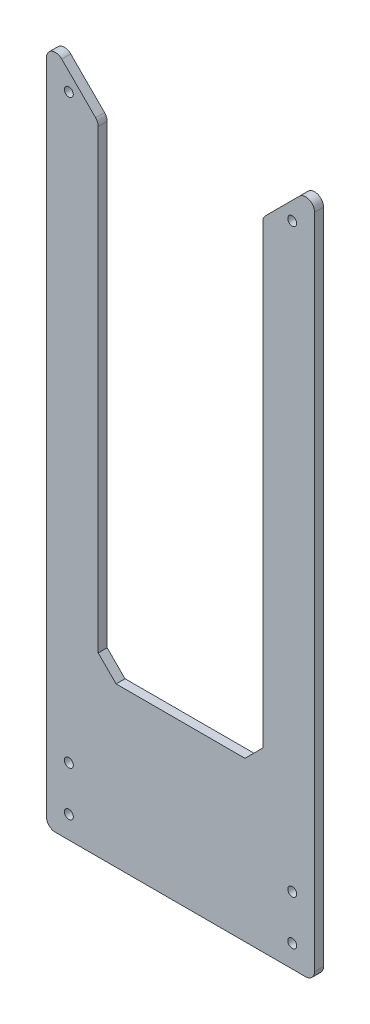
ISO-10303-21;
HEADER;
FILE_DESCRIPTION(('STEP AP214'),'2;1');
FILE_NAME('part.step','',(''),(''),'','','');
FILE_SCHEMA(('AUTOMOTIVE_DESIGN { 1 0 10303 214 1 1 1 1 }'));
ENDSEC;
DATA;
#1=APPLICATION_CONTEXT('core data for automotive mechanical design processes');
#2=APPLICATION_PROTOCOL_DEFINITION('international standard','automotive_design',2000,#1);
#3=PRODUCT_CONTEXT('',#1,'mechanical');
#4=PRODUCT('Part','Part','',(#3));
#5=PRODUCT_RELATED_PRODUCT_CATEGORY('part','',(#4));
#6=PRODUCT_DEFINITION_FORMATION('','',#4);
#7=PRODUCT_DEFINITION_CONTEXT('part definition',#1,'design');
#8=PRODUCT_DEFINITION('design','',#6,#7);
#9=PRODUCT_DEFINITION_SHAPE('','',#8);
#10=(LENGTH_UNIT() NAMED_UNIT(*) SI_UNIT(.MILLI.,.METRE.));
#11=(NAMED_UNIT(*) PLANE_ANGLE_UNIT() SI_UNIT($,.RADIAN.));
#12=(NAMED_UNIT(*) SI_UNIT($,.STERADIAN.) SOLID_ANGLE_UNIT());
#13=UNCERTAINTY_MEASURE_WITH_UNIT(LENGTH_MEASURE(1.E-05),#10,'distance_accuracy_value','');
#14=(GEOMETRIC_REPRESENTATION_CONTEXT(3) GLOBAL_UNCERTAINTY_ASSIGNED_CONTEXT((#13)) GLOBAL_UNIT_ASSIGNED_CONTEXT((#10,
#11,#12)) REPRESENTATION_CONTEXT('',''));
#15=CARTESIAN_POINT('',(0.,0.,0.));
#16=DIRECTION('',(0.,0.,1.));
#17=DIRECTION('',(1.,0.,0.));
#18=AXIS2_PLACEMENT_3D('',#15,#16,#17);
#19=CARTESIAN_POINT('',(82.6518546228437,1.34501312842872E-06,1.));
#20=DIRECTION('',(0.,0.,1.));
#21=DIRECTION('',(1.,0.,0.));
#22=AXIS2_PLACEMENT_3D('',#19,#20,#21);
#23=PLANE('',#22);
#24=CARTESIAN_POINT('',(56.1518546228437,1.50000134501313,1.));
#25=DIRECTION('',(0.,0.,1.));
#26=DIRECTION('',(1.,0.,0.));
#27=AXIS2_PLACEMENT_3D('',#24,#25,#26);
#28=CIRCLE('',#27,0.5);
#29=CARTESIAN_POINT('',(56.6518546228437,1.50000134501313,1.));
#30=VERTEX_POINT('',#29);
#31=EDGE_CURVE('E350',#30,#30,#28,.T.);
#32=ORIENTED_EDGE('',*,*,#31,.F.);
#33=EDGE_LOOP('',(#32));
#34=FACE_BOUND('',#33,.T.);
#35=CARTESIAN_POINT('',(81.1518546228437,6.50000134501313,1.));
#36=DIRECTION('',(0.,0.,1.));
#37=DIRECTION('',(1.,0.,0.));
#38=AXIS2_PLACEMENT_3D('',#35,#36,#37);
#39=CIRCLE('',#38,0.5);
#40=CARTESIAN_POINT('',(81.6518546228437,6.50000134501313,1.));
#41=VERTEX_POINT('',#40);
#42=EDGE_CURVE('E362',#41,#41,#39,.T.);
#43=ORIENTED_EDGE('',*,*,#42,.F.);
#44=EDGE_LOOP('',(#43));
#45=FACE_BOUND('',#44,.T.);
#46=CARTESIAN_POINT('',(56.1518546228437,6.50000134501313,1.));
#47=DIRECTION('',(0.,0.,1.));
#48=DIRECTION('',(1.,0.,0.));
#49=AXIS2_PLACEMENT_3D('',#46,#47,#48);
#50=CIRCLE('',#49,0.5);
#51=CARTESIAN_POINT('',(56.6518546228437,6.50000134501313,1.));
#52=VERTEX_POINT('',#51);
#53=EDGE_CURVE('E181',#52,#52,#50,.T.);
#54=ORIENTED_EDGE('',*,*,#53,.F.);
#55=EDGE_LOOP('',(#54));
#56=FACE_BOUND('',#55,.T.);
#57=CARTESIAN_POINT('',(82.6518546228437,1.34501312842872E-06,1.));
#58=DIRECTION('',(0.,0.,1.));
#59=DIRECTION('',(1.,0.,0.));
#60=AXIS2_PLACEMENT_3D('',#57,#58,#59);
#61=CIRCLE('',#60,1.);
#62=CARTESIAN_POINT('',(82.6518546228437,-0.999998654986872,1.));
#63=VERTEX_POINT('',#62);
#64=CARTESIAN_POINT('',(83.6518546228437,1.34501312842872E-06,1.));
#65=VERTEX_POINT('',#64);
#66=EDGE_CURVE('E208',#63,#65,#61,.T.);
#67=ORIENTED_EDGE('',*,*,#66,.T.);
#68=DIRECTION('',(0.,1.,0.));
#69=VECTOR('',#68,1.);
#70=CARTESIAN_POINT('',(83.6518546228437,1.34501312842872E-06,1.));
#71=LINE('',#70,#69);
#72=CARTESIAN_POINT('',(83.6518546228437,73.5857877826402,1.));
#73=VERTEX_POINT('',#72);
#74=EDGE_CURVE('E116',#65,#73,#71,.T.);
#75=ORIENTED_EDGE('',*,*,#74,.T.);
#76=CARTESIAN_POINT('',(82.6518546228437,73.5857877826402,1.));
#77=DIRECTION('',(0.,0.,1.));
#78=DIRECTION('',(1.,0.,0.));
#79=AXIS2_PLACEMENT_3D('',#76,#77,#78);
#80=CIRCLE('',#79,0.999999999999999);
#81=CARTESIAN_POINT('',(81.9447478416572,74.2928945638268,1.));
#82=VERTEX_POINT('',#81);
#83=EDGE_CURVE('E247',#73,#82,#80,.T.);
#84=ORIENTED_EDGE('',*,*,#83,.T.);
#85=DIRECTION('',(-0.707106781186594,-0.707106781186501,0.));
#86=VECTOR('',#85,1.);
#87=CARTESIAN_POINT('',(78.1547478416572,70.5028945638273,1.));
#88=LINE('',#87,#86);
#89=CARTESIAN_POINT('',(78.1547478416572,70.5028945638273,1.));
#90=VERTEX_POINT('',#89);
#91=EDGE_CURVE('E266',#82,#90,#88,.T.);
#92=ORIENTED_EDGE('',*,*,#91,.T.);
#93=CARTESIAN_POINT('',(78.8618546228438,69.7957877826407,1.));
#94=DIRECTION('',(0.,0.,1.));
#95=DIRECTION('',(1.,0.,0.));
#96=AXIS2_PLACEMENT_3D('',#93,#94,#95);
#97=CIRCLE('',#96,1.);
#98=CARTESIAN_POINT('',(77.8618546228437,69.7957877826407,1.));
#99=VERTEX_POINT('',#98);
#100=EDGE_CURVE('E263',#90,#99,#97,.T.);
#101=ORIENTED_EDGE('',*,*,#100,.T.);
#102=DIRECTION('',(0.,-1.,0.));
#103=VECTOR('',#102,1.);
#104=CARTESIAN_POINT('',(77.8618546228437,18.7800017339257,1.));
#105=LINE('',#104,#103);
#106=CARTESIAN_POINT('',(77.8618546228437,18.7800017339257,1.));
#107=VERTEX_POINT('',#106);
#108=EDGE_CURVE('E265',#99,#107,#105,.T.);
#109=ORIENTED_EDGE('',*,*,#108,.T.);
#110=DIRECTION('',(-0.707107615724972,-0.707105946647138,0.));
#111=VECTOR('',#110,1.);
#112=CARTESIAN_POINT('',(75.8618495130604,16.7800013450139,1.));
#113=LINE('',#112,#111);
#114=CARTESIAN_POINT('',(75.8618495130604,16.7800013450139,1.));
#115=VERTEX_POINT('',#114);
#116=EDGE_CURVE('E268',#107,#115,#113,.T.);
#117=ORIENTED_EDGE('',*,*,#116,.T.);
#118=DIRECTION('',(-1.,0.,0.));
#119=VECTOR('',#118,1.);
#120=CARTESIAN_POINT('',(61.4418495130604,16.7800013450139,1.));
#121=LINE('',#120,#119);
#122=CARTESIAN_POINT('',(61.4418495130604,16.7800013450139,1.));
#123=VERTEX_POINT('',#122);
#124=EDGE_CURVE('E274',#115,#123,#121,.T.);
#125=ORIENTED_EDGE('',*,*,#124,.T.);
#126=DIRECTION('',(-0.707105809143563,0.707107753228196,0.));
#127=VECTOR('',#126,1.);
#128=CARTESIAN_POINT('',(59.4418546228437,18.7800017339257,1.));
#129=LINE('',#128,#127);
#130=CARTESIAN_POINT('',(59.4418546228437,18.7800017339257,1.));
#131=VERTEX_POINT('',#130);
#132=EDGE_CURVE('E276',#123,#131,#129,.T.);
#133=ORIENTED_EDGE('',*,*,#132,.T.);
#134=DIRECTION('',(0.,1.,0.));
#135=VECTOR('',#134,1.);
#136=CARTESIAN_POINT('',(59.4418546228437,69.79578778264,1.));
#137=LINE('',#136,#135);
#138=CARTESIAN_POINT('',(59.4418546228437,69.79578778264,1.));
#139=VERTEX_POINT('',#138);
#140=EDGE_CURVE('E278',#131,#139,#137,.T.);
#141=ORIENTED_EDGE('',*,*,#140,.T.);
#142=CARTESIAN_POINT('',(58.4418546228437,69.79578778264,1.));
#143=DIRECTION('',(0.,0.,1.));
#144=DIRECTION('',(1.,0.,0.));
#145=AXIS2_PLACEMENT_3D('',#142,#143,#144);
#146=CIRCLE('',#145,1.);
#147=CARTESIAN_POINT('',(59.1489614040303,70.5028945638266,1.));
#148=VERTEX_POINT('',#147);
#149=EDGE_CURVE('E280',#139,#148,#146,.T.);
#150=ORIENTED_EDGE('',*,*,#149,.T.);
#151=DIRECTION('',(-0.707106781186547,0.707106781186547,0.));
#152=VECTOR('',#151,1.);
#153=CARTESIAN_POINT('',(55.3589614040303,74.2928945638266,1.));
#154=LINE('',#153,#152);
#155=CARTESIAN_POINT('',(55.3589614040303,74.2928945638266,1.));
#156=VERTEX_POINT('',#155);
#157=EDGE_CURVE('E282',#148,#156,#154,.T.);
#158=ORIENTED_EDGE('',*,*,#157,.T.);
#159=CARTESIAN_POINT('',(54.6518546228437,73.58578778264,1.));
#160=DIRECTION('',(0.,0.,1.));
#161=DIRECTION('',(1.,0.,0.));
#162=AXIS2_PLACEMENT_3D('',#159,#160,#161);
#163=CIRCLE('',#162,1.);
#164=CARTESIAN_POINT('',(53.6518546228437,73.58578778264,1.));
#165=VERTEX_POINT('',#164);
#166=EDGE_CURVE('E159',#156,#165,#163,.T.);
#167=ORIENTED_EDGE('',*,*,#166,.T.);
#168=DIRECTION('',(0.,-1.,0.));
#169=VECTOR('',#168,1.);
#170=CARTESIAN_POINT('',(53.6518546228437,1.34501313198143E-06,1.));
#171=LINE('',#170,#169);
#172=CARTESIAN_POINT('',(53.6518546228437,1.34501313200502E-06,1.));
#173=VERTEX_POINT('',#172);
#174=EDGE_CURVE('E153',#165,#173,#171,.T.);
#175=ORIENTED_EDGE('',*,*,#174,.T.);
#176=CARTESIAN_POINT('',(54.6518546228437,1.34501313277073E-06,1.));
#177=DIRECTION('',(0.,0.,1.));
#178=DIRECTION('',(1.,0.,0.));
#179=AXIS2_PLACEMENT_3D('',#176,#177,#178);
#180=CIRCLE('',#179,1.);
#181=CARTESIAN_POINT('',(54.6518546228437,-0.999998654986868,1.));
#182=VERTEX_POINT('',#181);
#183=EDGE_CURVE('E157',#173,#182,#180,.T.);
#184=ORIENTED_EDGE('',*,*,#183,.T.);
#185=DIRECTION('',(1.,0.,0.));
#186=VECTOR('',#185,1.);
#187=CARTESIAN_POINT('',(82.6518546228437,-0.999998654986872,1.));
#188=LINE('',#187,#186);
#189=EDGE_CURVE('E49',#182,#63,#188,.T.);
#190=ORIENTED_EDGE('',*,*,#189,.T.);
#191=EDGE_LOOP('',(#67,#75,#84,#92,#101,#109,#117,#125,#133,#141,#150,#158,#167,#175,#184,#190));
#192=FACE_BOUND('',#191,.T.);
#193=CARTESIAN_POINT('',(56.1518546228437,71.5000013450131,1.));
#194=DIRECTION('',(0.,0.,1.));
#195=DIRECTION('',(1.,0.,0.));
#196=AXIS2_PLACEMENT_3D('',#193,#194,#195);
#197=CIRCLE('',#196,0.5);
#198=CARTESIAN_POINT('',(56.6518546228437,71.5000013450131,1.));
#199=VERTEX_POINT('',#198);
#200=EDGE_CURVE('E368',#199,#199,#197,.T.);
#201=ORIENTED_EDGE('',*,*,#200,.F.);
#202=EDGE_LOOP('',(#201));
#203=FACE_BOUND('',#202,.T.);
#204=CARTESIAN_POINT('',(81.1518546228437,71.5000013450131,1.));
#205=DIRECTION('',(0.,0.,1.));
#206=DIRECTION('',(1.,0.,0.));
#207=AXIS2_PLACEMENT_3D('',#204,#205,#206);
#208=CIRCLE('',#207,0.5);
#209=CARTESIAN_POINT('',(81.6518546228437,71.5000013450131,1.));
#210=VERTEX_POINT('',#209);
#211=EDGE_CURVE('E356',#210,#210,#208,.T.);
#212=ORIENTED_EDGE('',*,*,#211,.F.);
#213=EDGE_LOOP('',(#212));
#214=FACE_BOUND('',#213,.T.);
#215=CARTESIAN_POINT('',(81.1518546228437,1.50000134501313,1.));
#216=DIRECTION('',(0.,0.,1.));
#217=DIRECTION('',(1.,0.,0.));
#218=AXIS2_PLACEMENT_3D('',#215,#216,#217);
#219=CIRCLE('',#218,0.5);
#220=CARTESIAN_POINT('',(81.6518546228437,1.50000134501313,1.));
#221=VERTEX_POINT('',#220);
#222=EDGE_CURVE('E341',#221,#221,#219,.T.);
#223=ORIENTED_EDGE('',*,*,#222,.F.);
#224=EDGE_LOOP('',(#223));
#225=FACE_BOUND('',#224,.T.);
#226=ADVANCED_FACE('F32',(#34,#45,#56,#192,#203,#214,#225),#23,.T.);
#227=CARTESIAN_POINT('',(82.6518546228437,1.34501312842872E-06,0.));
#228=DIRECTION('',(0.,0.,1.));
#229=DIRECTION('',(1.,0.,0.));
#230=AXIS2_PLACEMENT_3D('',#227,#228,#229);
#231=PLANE('',#230);
#232=CARTESIAN_POINT('',(82.6518546228437,1.34501312842872E-06,0.));
#233=DIRECTION('',(0.,0.,1.));
#234=DIRECTION('',(1.,0.,0.));
#235=AXIS2_PLACEMENT_3D('',#232,#233,#234);
#236=CIRCLE('',#235,1.);
#237=CARTESIAN_POINT('',(82.6518546228437,-0.999998654986872,0.));
#238=VERTEX_POINT('',#237);
#239=CARTESIAN_POINT('',(83.6518546228437,1.34501312842872E-06,0.));
#240=VERTEX_POINT('',#239);
#241=EDGE_CURVE('E177',#238,#240,#236,.T.);
#242=ORIENTED_EDGE('',*,*,#241,.F.);
#243=DIRECTION('',(1.,0.,0.));
#244=VECTOR('',#243,1.);
#245=CARTESIAN_POINT('',(82.6518546228437,-0.999998654986872,0.));
#246=LINE('',#245,#244);
#247=CARTESIAN_POINT('',(54.6518546228437,-0.999998654986868,0.));
#248=VERTEX_POINT('',#247);
#249=EDGE_CURVE('E108',#248,#238,#246,.T.);
#250=ORIENTED_EDGE('',*,*,#249,.F.);
#251=CARTESIAN_POINT('',(54.6518546228437,1.34501313277073E-06,0.));
#252=DIRECTION('',(0.,0.,1.));
#253=DIRECTION('',(1.,0.,0.));
#254=AXIS2_PLACEMENT_3D('',#251,#252,#253);
#255=CIRCLE('',#254,1.);
#256=CARTESIAN_POINT('',(53.6518546228437,1.34501313200502E-06,0.));
#257=VERTEX_POINT('',#256);
#258=EDGE_CURVE('E102',#257,#248,#255,.T.);
#259=ORIENTED_EDGE('',*,*,#258,.F.);
#260=DIRECTION('',(0.,-1.,0.));
#261=VECTOR('',#260,1.);
#262=CARTESIAN_POINT('',(53.6518546228437,1.34501313198143E-06,0.));
#263=LINE('',#262,#261);
#264=CARTESIAN_POINT('',(53.6518546228437,73.58578778264,0.));
#265=VERTEX_POINT('',#264);
#266=EDGE_CURVE('E167',#265,#257,#263,.T.);
#267=ORIENTED_EDGE('',*,*,#266,.F.);
#268=CARTESIAN_POINT('',(54.6518546228437,73.58578778264,0.));
#269=DIRECTION('',(0.,0.,1.));
#270=DIRECTION('',(1.,0.,0.));
#271=AXIS2_PLACEMENT_3D('',#268,#269,#270);
#272=CIRCLE('',#271,1.);
#273=CARTESIAN_POINT('',(55.3589614040303,74.2928945638266,0.));
#274=VERTEX_POINT('',#273);
#275=EDGE_CURVE('E203',#274,#265,#272,.T.);
#276=ORIENTED_EDGE('',*,*,#275,.F.);
#277=DIRECTION('',(-0.707106781186547,0.707106781186547,0.));
#278=VECTOR('',#277,1.);
#279=CARTESIAN_POINT('',(55.3589614040303,74.2928945638266,0.));
#280=LINE('',#279,#278);
#281=CARTESIAN_POINT('',(59.1489614040303,70.5028945638266,0.));
#282=VERTEX_POINT('',#281);
#283=EDGE_CURVE('E201',#282,#274,#280,.T.);
#284=ORIENTED_EDGE('',*,*,#283,.F.);
#285=CARTESIAN_POINT('',(58.4418546228437,69.79578778264,0.));
#286=DIRECTION('',(0.,0.,1.));
#287=DIRECTION('',(1.,0.,0.));
#288=AXIS2_PLACEMENT_3D('',#285,#286,#287);
#289=CIRCLE('',#288,1.);
#290=CARTESIAN_POINT('',(59.4418546228437,69.79578778264,0.));
#291=VERTEX_POINT('',#290);
#292=EDGE_CURVE('E199',#291,#282,#289,.T.);
#293=ORIENTED_EDGE('',*,*,#292,.F.);
#294=DIRECTION('',(0.,1.,0.));
#295=VECTOR('',#294,1.);
#296=CARTESIAN_POINT('',(59.4418546228437,69.79578778264,0.));
#297=LINE('',#296,#295);
#298=CARTESIAN_POINT('',(59.4418546228437,18.7800017339257,0.));
#299=VERTEX_POINT('',#298);
#300=EDGE_CURVE('E197',#299,#291,#297,.T.);
#301=ORIENTED_EDGE('',*,*,#300,.F.);
#302=DIRECTION('',(-0.707105809143563,0.707107753228196,0.));
#303=VECTOR('',#302,1.);
#304=CARTESIAN_POINT('',(59.4418546228437,18.7800017339257,0.));
#305=LINE('',#304,#303);
#306=CARTESIAN_POINT('',(61.4418495130604,16.7800013450139,0.));
#307=VERTEX_POINT('',#306);
#308=EDGE_CURVE('E195',#307,#299,#305,.T.);
#309=ORIENTED_EDGE('',*,*,#308,.F.);
#310=DIRECTION('',(-1.,0.,0.));
#311=VECTOR('',#310,1.);
#312=CARTESIAN_POINT('',(61.4418495130604,16.7800013450139,0.));
#313=LINE('',#312,#311);
#314=CARTESIAN_POINT('',(75.8618495130604,16.7800013450139,0.));
#315=VERTEX_POINT('',#314);
#316=EDGE_CURVE('E193',#315,#307,#313,.T.);
#317=ORIENTED_EDGE('',*,*,#316,.F.);
#318=DIRECTION('',(-0.707107615724972,-0.707105946647138,0.));
#319=VECTOR('',#318,1.);
#320=CARTESIAN_POINT('',(75.8618495130604,16.7800013450139,0.));
#321=LINE('',#320,#319);
#322=CARTESIAN_POINT('',(77.8618546228437,18.7800017339257,0.));
#323=VERTEX_POINT('',#322);
#324=EDGE_CURVE('E191',#323,#315,#321,.T.);
#325=ORIENTED_EDGE('',*,*,#324,.F.);
#326=DIRECTION('',(0.,-1.,0.));
#327=VECTOR('',#326,1.);
#328=CARTESIAN_POINT('',(77.8618546228437,18.7800017339257,0.));
#329=LINE('',#328,#327);
#330=CARTESIAN_POINT('',(77.8618546228437,69.7957877826407,0.));
#331=VERTEX_POINT('',#330);
#332=EDGE_CURVE('E189',#331,#323,#329,.T.);
#333=ORIENTED_EDGE('',*,*,#332,.F.);
#334=CARTESIAN_POINT('',(78.8618546228438,69.7957877826407,0.));
#335=DIRECTION('',(0.,0.,1.));
#336=DIRECTION('',(1.,0.,0.));
#337=AXIS2_PLACEMENT_3D('',#334,#335,#336);
#338=CIRCLE('',#337,1.);
#339=CARTESIAN_POINT('',(78.1547478416572,70.5028945638273,0.));
#340=VERTEX_POINT('',#339);
#341=EDGE_CURVE('E187',#340,#331,#338,.T.);
#342=ORIENTED_EDGE('',*,*,#341,.F.);
#343=DIRECTION('',(-0.707106781186594,-0.707106781186501,0.));
#344=VECTOR('',#343,1.);
#345=CARTESIAN_POINT('',(78.1547478416572,70.5028945638273,0.));
#346=LINE('',#345,#344);
#347=CARTESIAN_POINT('',(81.9447478416572,74.2928945638268,0.));
#348=VERTEX_POINT('',#347);
#349=EDGE_CURVE('E185',#348,#340,#346,.T.);
#350=ORIENTED_EDGE('',*,*,#349,.F.);
#351=CARTESIAN_POINT('',(82.6518546228437,73.5857877826402,0.));
#352=DIRECTION('',(0.,0.,1.));
#353=DIRECTION('',(1.,0.,0.));
#354=AXIS2_PLACEMENT_3D('',#351,#352,#353);
#355=CIRCLE('',#354,0.999999999999999);
#356=CARTESIAN_POINT('',(83.6518546228437,73.5857877826402,0.));
#357=VERTEX_POINT('',#356);
#358=EDGE_CURVE('E183',#357,#348,#355,.T.);
#359=ORIENTED_EDGE('',*,*,#358,.F.);
#360=DIRECTION('',(0.,1.,0.));
#361=VECTOR('',#360,1.);
#362=CARTESIAN_POINT('',(83.6518546228437,1.34501312842872E-06,0.));
#363=LINE('',#362,#361);
#364=EDGE_CURVE('E180',#240,#357,#363,.T.);
#365=ORIENTED_EDGE('',*,*,#364,.F.);
#366=EDGE_LOOP('',(#242,#250,#259,#267,#276,#284,#293,#301,#309,#317,#325,#333,#342,#350,#359,#365));
#367=FACE_BOUND('',#366,.T.);
#368=CARTESIAN_POINT('',(56.1518546228437,6.50000134501313,0.));
#369=DIRECTION('',(0.,0.,1.));
#370=DIRECTION('',(1.,0.,0.));
#371=AXIS2_PLACEMENT_3D('',#368,#369,#370);
#372=CIRCLE('',#371,0.5);
#373=CARTESIAN_POINT('',(56.6518546228437,6.50000134501313,0.));
#374=VERTEX_POINT('',#373);
#375=EDGE_CURVE('E371',#374,#374,#372,.T.);
#376=ORIENTED_EDGE('',*,*,#375,.T.);
#377=EDGE_LOOP('',(#376));
#378=FACE_BOUND('',#377,.T.);
#379=CARTESIAN_POINT('',(56.1518546228437,71.5000013450131,0.));
#380=DIRECTION('',(0.,0.,1.));
#381=DIRECTION('',(1.,0.,0.));
#382=AXIS2_PLACEMENT_3D('',#379,#380,#381);
#383=CIRCLE('',#382,0.5);
#384=CARTESIAN_POINT('',(56.6518546228437,71.5000013450131,0.));
#385=VERTEX_POINT('',#384);
#386=EDGE_CURVE('E365',#385,#385,#383,.T.);
#387=ORIENTED_EDGE('',*,*,#386,.T.);
#388=EDGE_LOOP('',(#387));
#389=FACE_BOUND('',#388,.T.);
#390=CARTESIAN_POINT('',(81.1518546228437,6.50000134501313,0.));
#391=DIRECTION('',(0.,0.,1.));
#392=DIRECTION('',(1.,0.,0.));
#393=AXIS2_PLACEMENT_3D('',#390,#391,#392);
#394=CIRCLE('',#393,0.5);
#395=CARTESIAN_POINT('',(81.6518546228437,6.50000134501313,0.));
#396=VERTEX_POINT('',#395);
#397=EDGE_CURVE('E359',#396,#396,#394,.T.);
#398=ORIENTED_EDGE('',*,*,#397,.T.);
#399=EDGE_LOOP('',(#398));
#400=FACE_BOUND('',#399,.T.);
#401=CARTESIAN_POINT('',(81.1518546228437,71.5000013450131,0.));
#402=DIRECTION('',(0.,0.,1.));
#403=DIRECTION('',(1.,0.,0.));
#404=AXIS2_PLACEMENT_3D('',#401,#402,#403);
#405=CIRCLE('',#404,0.5);
#406=CARTESIAN_POINT('',(81.6518546228437,71.5000013450131,0.));
#407=VERTEX_POINT('',#406);
#408=EDGE_CURVE('E353',#407,#407,#405,.T.);
#409=ORIENTED_EDGE('',*,*,#408,.T.);
#410=EDGE_LOOP('',(#409));
#411=FACE_BOUND('',#410,.T.);
#412=CARTESIAN_POINT('',(56.1518546228437,1.50000134501313,0.));
#413=DIRECTION('',(0.,0.,1.));
#414=DIRECTION('',(1.,0.,0.));
#415=AXIS2_PLACEMENT_3D('',#412,#413,#414);
#416=CIRCLE('',#415,0.5);
#417=CARTESIAN_POINT('',(56.6518546228437,1.50000134501313,0.));
#418=VERTEX_POINT('',#417);
#419=EDGE_CURVE('E347',#418,#418,#416,.T.);
#420=ORIENTED_EDGE('',*,*,#419,.T.);
#421=EDGE_LOOP('',(#420));
#422=FACE_BOUND('',#421,.T.);
#423=CARTESIAN_POINT('',(81.1518546228437,1.50000134501313,0.));
#424=DIRECTION('',(0.,0.,1.));
#425=DIRECTION('',(1.,0.,0.));
#426=AXIS2_PLACEMENT_3D('',#423,#424,#425);
#427=CIRCLE('',#426,0.5);
#428=CARTESIAN_POINT('',(81.6518546228437,1.50000134501313,0.));
#429=VERTEX_POINT('',#428);
#430=EDGE_CURVE('E344',#429,#429,#427,.T.);
#431=ORIENTED_EDGE('',*,*,#430,.T.);
#432=EDGE_LOOP('',(#431));
#433=FACE_BOUND('',#432,.T.);
#434=ADVANCED_FACE('F251',(#367,#378,#389,#400,#411,#422,#433),#231,.F.);
#435=CARTESIAN_POINT('',(82.6518546228437,1.34501312842872E-06,1.));
#436=DIRECTION('',(0.,0.,-1.));
#437=DIRECTION('',(-1.,0.,0.));
#438=AXIS2_PLACEMENT_3D('',#435,#436,#437);
#439=CYLINDRICAL_SURFACE('',#438,1.);
#440=ORIENTED_EDGE('',*,*,#241,.T.);
#441=DIRECTION('',(0.,0.,-1.));
#442=VECTOR('',#441,1.);
#443=CARTESIAN_POINT('',(83.6518546228437,1.34501312842872E-06,1.));
#444=LINE('',#443,#442);
#445=EDGE_CURVE('E11',#65,#240,#444,.T.);
#446=ORIENTED_EDGE('',*,*,#445,.F.);
#447=ORIENTED_EDGE('',*,*,#66,.F.);
#448=DIRECTION('',(0.,0.,-1.));
#449=VECTOR('',#448,1.);
#450=CARTESIAN_POINT('',(82.6518546228437,-0.999998654986872,1.));
#451=LINE('',#450,#449);
#452=EDGE_CURVE('E173',#63,#238,#451,.T.);
#453=ORIENTED_EDGE('',*,*,#452,.T.);
#454=EDGE_LOOP('',(#440,#446,#447,#453));
#455=FACE_BOUND('',#454,.T.);
#456=ADVANCED_FACE('F34',(#455),#439,.T.);
#457=CARTESIAN_POINT('',(83.6518546228437,1.34501312842872E-06,1.));
#458=DIRECTION('',(-1.,0.,0.));
#459=DIRECTION('',(0.,0.,1.));
#460=AXIS2_PLACEMENT_3D('',#457,#458,#459);
#461=PLANE('',#460);
#462=ORIENTED_EDGE('',*,*,#364,.T.);
#463=DIRECTION('',(0.,0.,-1.));
#464=VECTOR('',#463,1.);
#465=CARTESIAN_POINT('',(83.6518546228437,73.5857877826402,1.));
#466=LINE('',#465,#464);
#467=EDGE_CURVE('E41',#73,#357,#466,.T.);
#468=ORIENTED_EDGE('',*,*,#467,.F.);
#469=ORIENTED_EDGE('',*,*,#74,.F.);
#470=ORIENTED_EDGE('',*,*,#445,.T.);
#471=EDGE_LOOP('',(#462,#468,#469,#470));
#472=FACE_BOUND('',#471,.T.);
#473=ADVANCED_FACE('F539',(#472),#461,.F.);
#474=CARTESIAN_POINT('',(82.6518546228437,73.5857877826402,1.));
#475=DIRECTION('',(0.,0.,-1.));
#476=DIRECTION('',(-1.,0.,0.));
#477=AXIS2_PLACEMENT_3D('',#474,#475,#476);
#478=CYLINDRICAL_SURFACE('',#477,0.999999999999999);
#479=ORIENTED_EDGE('',*,*,#358,.T.);
#480=DIRECTION('',(0.,0.,-1.));
#481=VECTOR('',#480,1.);
#482=CARTESIAN_POINT('',(81.9447478416572,74.2928945638268,1.));
#483=LINE('',#482,#481);
#484=EDGE_CURVE('E239',#82,#348,#483,.T.);
#485=ORIENTED_EDGE('',*,*,#484,.F.);
#486=ORIENTED_EDGE('',*,*,#83,.F.);
#487=ORIENTED_EDGE('',*,*,#467,.T.);
#488=EDGE_LOOP('',(#479,#485,#486,#487));
#489=FACE_BOUND('',#488,.T.);
#490=ADVANCED_FACE('F245',(#489),#478,.T.);
#491=CARTESIAN_POINT('',(78.1547478416572,70.5028945638273,1.));
#492=DIRECTION('',(0.707106781186501,-0.707106781186594,0.));
#493=DIRECTION('',(0.707106781186594,0.707106781186501,0.));
#494=AXIS2_PLACEMENT_3D('',#491,#492,#493);
#495=PLANE('',#494);
#496=ORIENTED_EDGE('',*,*,#349,.T.);
#497=DIRECTION('',(0.,0.,-1.));
#498=VECTOR('',#497,1.);
#499=CARTESIAN_POINT('',(78.1547478416572,70.5028945638273,1.));
#500=LINE('',#499,#498);
#501=EDGE_CURVE('E236',#90,#340,#500,.T.);
#502=ORIENTED_EDGE('',*,*,#501,.F.);
#503=ORIENTED_EDGE('',*,*,#91,.F.);
#504=ORIENTED_EDGE('',*,*,#484,.T.);
#505=EDGE_LOOP('',(#496,#502,#503,#504));
#506=FACE_BOUND('',#505,.T.);
#507=ADVANCED_FACE('F257',(#506),#495,.F.);
#508=CARTESIAN_POINT('',(78.8618546228438,69.7957877826407,1.));
#509=DIRECTION('',(0.,0.,-1.));
#510=DIRECTION('',(-1.,0.,0.));
#511=AXIS2_PLACEMENT_3D('',#508,#509,#510);
#512=CYLINDRICAL_SURFACE('',#511,1.);
#513=ORIENTED_EDGE('',*,*,#341,.T.);
#514=DIRECTION('',(0.,0.,-1.));
#515=VECTOR('',#514,1.);
#516=CARTESIAN_POINT('',(77.8618546228437,69.7957877826407,1.));
#517=LINE('',#516,#515);
#518=EDGE_CURVE('E233',#99,#331,#517,.T.);
#519=ORIENTED_EDGE('',*,*,#518,.F.);
#520=ORIENTED_EDGE('',*,*,#100,.F.);
#521=ORIENTED_EDGE('',*,*,#501,.T.);
#522=EDGE_LOOP('',(#513,#519,#520,#521));
#523=FACE_BOUND('',#522,.T.);
#524=ADVANCED_FACE('F261',(#523),#512,.T.);
#525=CARTESIAN_POINT('',(77.8618546228437,18.7800017339257,1.));
#526=DIRECTION('',(1.,0.,0.));
#527=DIRECTION('',(0.,0.,-1.));
#528=AXIS2_PLACEMENT_3D('',#525,#526,#527);
#529=PLANE('',#528);
#530=ORIENTED_EDGE('',*,*,#332,.T.);
#531=DIRECTION('',(0.,0.,-1.));
#532=VECTOR('',#531,1.);
#533=CARTESIAN_POINT('',(77.8618546228437,18.7800017339257,1.));
#534=LINE('',#533,#532);
#535=EDGE_CURVE('E230',#107,#323,#534,.T.);
#536=ORIENTED_EDGE('',*,*,#535,.F.);
#537=ORIENTED_EDGE('',*,*,#108,.F.);
#538=ORIENTED_EDGE('',*,*,#518,.T.);
#539=EDGE_LOOP('',(#530,#536,#537,#538));
#540=FACE_BOUND('',#539,.T.);
#541=ADVANCED_FACE('F504',(#540),#529,.F.);
#542=CARTESIAN_POINT('',(75.8618495130604,16.7800013450139,1.));
#543=DIRECTION('',(0.707105946647138,-0.707107615724972,0.));
#544=DIRECTION('',(0.707107615724972,0.707105946647138,0.));
#545=AXIS2_PLACEMENT_3D('',#542,#543,#544);
#546=PLANE('',#545);
#547=ORIENTED_EDGE('',*,*,#324,.T.);
#548=DIRECTION('',(0.,0.,-1.));
#549=VECTOR('',#548,1.);
#550=CARTESIAN_POINT('',(75.8618495130604,16.7800013450139,1.));
#551=LINE('',#550,#549);
#552=EDGE_CURVE('E227',#115,#315,#551,.T.);
#553=ORIENTED_EDGE('',*,*,#552,.F.);
#554=ORIENTED_EDGE('',*,*,#116,.F.);
#555=ORIENTED_EDGE('',*,*,#535,.T.);
#556=EDGE_LOOP('',(#547,#553,#554,#555));
#557=FACE_BOUND('',#556,.T.);
#558=ADVANCED_FACE('F494',(#557),#546,.F.);
#559=CARTESIAN_POINT('',(61.4418495130604,16.7800013450139,1.));
#560=DIRECTION('',(0.,-1.,0.));
#561=DIRECTION('',(0.,0.,-1.));
#562=AXIS2_PLACEMENT_3D('',#559,#560,#561);
#563=PLANE('',#562);
#564=ORIENTED_EDGE('',*,*,#316,.T.);
#565=DIRECTION('',(0.,0.,-1.));
#566=VECTOR('',#565,1.);
#567=CARTESIAN_POINT('',(61.4418495130604,16.7800013450139,1.));
#568=LINE('',#567,#566);
#569=EDGE_CURVE('E224',#123,#307,#568,.T.);
#570=ORIENTED_EDGE('',*,*,#569,.F.);
#571=ORIENTED_EDGE('',*,*,#124,.F.);
#572=ORIENTED_EDGE('',*,*,#552,.T.);
#573=EDGE_LOOP('',(#564,#570,#571,#572));
#574=FACE_BOUND('',#573,.T.);
#575=ADVANCED_FACE('F484',(#574),#563,.F.);
#576=CARTESIAN_POINT('',(59.4418546228437,18.7800017339257,1.));
#577=DIRECTION('',(-0.707107753228196,-0.707105809143563,0.));
#578=DIRECTION('',(0.707105809143563,-0.707107753228196,0.));
#579=AXIS2_PLACEMENT_3D('',#576,#577,#578);
#580=PLANE('',#579);
#581=ORIENTED_EDGE('',*,*,#308,.T.);
#582=DIRECTION('',(0.,0.,-1.));
#583=VECTOR('',#582,1.);
#584=CARTESIAN_POINT('',(59.4418546228437,18.7800017339257,1.));
#585=LINE('',#584,#583);
#586=EDGE_CURVE('E221',#131,#299,#585,.T.);
#587=ORIENTED_EDGE('',*,*,#586,.F.);
#588=ORIENTED_EDGE('',*,*,#132,.F.);
#589=ORIENTED_EDGE('',*,*,#569,.T.);
#590=EDGE_LOOP('',(#581,#587,#588,#589));
#591=FACE_BOUND('',#590,.T.);
#592=ADVANCED_FACE('F474',(#591),#580,.F.);
#593=CARTESIAN_POINT('',(59.4418546228437,69.79578778264,1.));
#594=DIRECTION('',(-1.,0.,0.));
#595=DIRECTION('',(0.,0.,1.));
#596=AXIS2_PLACEMENT_3D('',#593,#594,#595);
#597=PLANE('',#596);
#598=ORIENTED_EDGE('',*,*,#300,.T.);
#599=DIRECTION('',(0.,0.,-1.));
#600=VECTOR('',#599,1.);
#601=CARTESIAN_POINT('',(59.4418546228437,69.79578778264,1.));
#602=LINE('',#601,#600);
#603=EDGE_CURVE('E218',#139,#291,#602,.T.);
#604=ORIENTED_EDGE('',*,*,#603,.F.);
#605=ORIENTED_EDGE('',*,*,#140,.F.);
#606=ORIENTED_EDGE('',*,*,#586,.T.);
#607=EDGE_LOOP('',(#598,#604,#605,#606));
#608=FACE_BOUND('',#607,.T.);
#609=ADVANCED_FACE('F464',(#608),#597,.F.);
#610=CARTESIAN_POINT('',(58.4418546228437,69.79578778264,1.));
#611=DIRECTION('',(0.,0.,-1.));
#612=DIRECTION('',(-1.,0.,0.));
#613=AXIS2_PLACEMENT_3D('',#610,#611,#612);
#614=CYLINDRICAL_SURFACE('',#613,1.);
#615=ORIENTED_EDGE('',*,*,#292,.T.);
#616=DIRECTION('',(0.,0.,-1.));
#617=VECTOR('',#616,1.);
#618=CARTESIAN_POINT('',(59.1489614040303,70.5028945638266,1.));
#619=LINE('',#618,#617);
#620=EDGE_CURVE('E215',#148,#282,#619,.T.);
#621=ORIENTED_EDGE('',*,*,#620,.F.);
#622=ORIENTED_EDGE('',*,*,#149,.F.);
#623=ORIENTED_EDGE('',*,*,#603,.T.);
#624=EDGE_LOOP('',(#615,#621,#622,#623));
#625=FACE_BOUND('',#624,.T.);
#626=ADVANCED_FACE('F455',(#625),#614,.T.);
#627=CARTESIAN_POINT('',(55.3589614040303,74.2928945638266,1.));
#628=DIRECTION('',(-0.707106781186547,-0.707106781186547,0.));
#629=DIRECTION('',(0.707106781186548,-0.707106781186548,0.));
#630=AXIS2_PLACEMENT_3D('',#627,#628,#629);
#631=PLANE('',#630);
#632=ORIENTED_EDGE('',*,*,#283,.T.);
#633=DIRECTION('',(0.,0.,-1.));
#634=VECTOR('',#633,1.);
#635=CARTESIAN_POINT('',(55.3589614040303,74.2928945638266,1.));
#636=LINE('',#635,#634);
#637=EDGE_CURVE('E212',#156,#274,#636,.T.);
#638=ORIENTED_EDGE('',*,*,#637,.F.);
#639=ORIENTED_EDGE('',*,*,#157,.F.);
#640=ORIENTED_EDGE('',*,*,#620,.T.);
#641=EDGE_LOOP('',(#632,#638,#639,#640));
#642=FACE_BOUND('',#641,.T.);
#643=ADVANCED_FACE('F288',(#642),#631,.F.);
#644=CARTESIAN_POINT('',(54.6518546228437,73.58578778264,1.));
#645=DIRECTION('',(0.,0.,-1.));
#646=DIRECTION('',(-1.,0.,0.));
#647=AXIS2_PLACEMENT_3D('',#644,#645,#646);
#648=CYLINDRICAL_SURFACE('',#647,1.);
#649=ORIENTED_EDGE('',*,*,#275,.T.);
#650=DIRECTION('',(0.,0.,-1.));
#651=VECTOR('',#650,1.);
#652=CARTESIAN_POINT('',(53.6518546228437,73.58578778264,1.));
#653=LINE('',#652,#651);
#654=EDGE_CURVE('E168',#165,#265,#653,.T.);
#655=ORIENTED_EDGE('',*,*,#654,.F.);
#656=ORIENTED_EDGE('',*,*,#166,.F.);
#657=ORIENTED_EDGE('',*,*,#637,.T.);
#658=EDGE_LOOP('',(#649,#655,#656,#657));
#659=FACE_BOUND('',#658,.T.);
#660=ADVANCED_FACE('F292',(#659),#648,.T.);
#661=CARTESIAN_POINT('',(53.6518546228437,1.34501313198143E-06,1.));
#662=DIRECTION('',(1.,0.,0.));
#663=DIRECTION('',(0.,0.,-1.));
#664=AXIS2_PLACEMENT_3D('',#661,#662,#663);
#665=PLANE('',#664);
#666=ORIENTED_EDGE('',*,*,#266,.T.);
#667=DIRECTION('',(0.,0.,-1.));
#668=VECTOR('',#667,1.);
#669=CARTESIAN_POINT('',(53.6518546228437,1.34501313200502E-06,1.));
#670=LINE('',#669,#668);
#671=EDGE_CURVE('E164',#173,#257,#670,.T.);
#672=ORIENTED_EDGE('',*,*,#671,.F.);
#673=ORIENTED_EDGE('',*,*,#174,.F.);
#674=ORIENTED_EDGE('',*,*,#654,.T.);
#675=EDGE_LOOP('',(#666,#672,#673,#674));
#676=FACE_BOUND('',#675,.T.);
#677=ADVANCED_FACE('F165',(#676),#665,.F.);
#678=CARTESIAN_POINT('',(54.6518546228437,1.34501313277073E-06,1.));
#679=DIRECTION('',(0.,0.,-1.));
#680=DIRECTION('',(-1.,0.,0.));
#681=AXIS2_PLACEMENT_3D('',#678,#679,#680);
#682=CYLINDRICAL_SURFACE('',#681,1.);
#683=ORIENTED_EDGE('',*,*,#258,.T.);
#684=DIRECTION('',(0.,0.,-1.));
#685=VECTOR('',#684,1.);
#686=CARTESIAN_POINT('',(54.6518546228437,-0.999998654986868,1.));
#687=LINE('',#686,#685);
#688=EDGE_CURVE('E169',#182,#248,#687,.T.);
#689=ORIENTED_EDGE('',*,*,#688,.F.);
#690=ORIENTED_EDGE('',*,*,#183,.F.);
#691=ORIENTED_EDGE('',*,*,#671,.T.);
#692=EDGE_LOOP('',(#683,#689,#690,#691));
#693=FACE_BOUND('',#692,.T.);
#694=ADVANCED_FACE('F171',(#693),#682,.T.);
#695=CARTESIAN_POINT('',(82.6518546228437,-0.999998654986872,1.));
#696=DIRECTION('',(0.,1.,0.));
#697=DIRECTION('',(-1.,0.,0.));
#698=AXIS2_PLACEMENT_3D('',#695,#696,#697);
#699=PLANE('',#698);
#700=ORIENTED_EDGE('',*,*,#249,.T.);
#701=ORIENTED_EDGE('',*,*,#452,.F.);
#702=ORIENTED_EDGE('',*,*,#189,.F.);
#703=ORIENTED_EDGE('',*,*,#688,.T.);
#704=EDGE_LOOP('',(#700,#701,#702,#703));
#705=FACE_BOUND('',#704,.T.);
#706=ADVANCED_FACE('F296',(#705),#699,.F.);
#707=CARTESIAN_POINT('',(56.1518546228437,6.50000134501313,1.));
#708=DIRECTION('',(0.,0.,-1.));
#709=DIRECTION('',(-1.,0.,0.));
#710=AXIS2_PLACEMENT_3D('',#707,#708,#709);
#711=CYLINDRICAL_SURFACE('',#710,0.5);
#712=ORIENTED_EDGE('',*,*,#53,.T.);
#713=EDGE_LOOP('',(#712));
#714=FACE_BOUND('',#713,.T.);
#715=ORIENTED_EDGE('',*,*,#375,.F.);
#716=EDGE_LOOP('',(#715));
#717=FACE_BOUND('',#716,.T.);
#718=ADVANCED_FACE('F298',(#714,#717),#711,.F.);
#719=CARTESIAN_POINT('',(56.1518546228437,71.5000013450131,1.));
#720=DIRECTION('',(0.,0.,-1.));
#721=DIRECTION('',(-1.,0.,0.));
#722=AXIS2_PLACEMENT_3D('',#719,#720,#721);
#723=CYLINDRICAL_SURFACE('',#722,0.5);
#724=ORIENTED_EDGE('',*,*,#200,.T.);
#725=EDGE_LOOP('',(#724));
#726=FACE_BOUND('',#725,.T.);
#727=ORIENTED_EDGE('',*,*,#386,.F.);
#728=EDGE_LOOP('',(#727));
#729=FACE_BOUND('',#728,.T.);
#730=ADVANCED_FACE('F304',(#726,#729),#723,.F.);
#731=CARTESIAN_POINT('',(81.1518546228437,6.50000134501313,1.));
#732=DIRECTION('',(0.,0.,-1.));
#733=DIRECTION('',(-1.,0.,0.));
#734=AXIS2_PLACEMENT_3D('',#731,#732,#733);
#735=CYLINDRICAL_SURFACE('',#734,0.5);
#736=ORIENTED_EDGE('',*,*,#42,.T.);
#737=EDGE_LOOP('',(#736));
#738=FACE_BOUND('',#737,.T.);
#739=ORIENTED_EDGE('',*,*,#397,.F.);
#740=EDGE_LOOP('',(#739));
#741=FACE_BOUND('',#740,.T.);
#742=ADVANCED_FACE('F320',(#738,#741),#735,.F.);
#743=CARTESIAN_POINT('',(81.1518546228437,71.5000013450131,1.));
#744=DIRECTION('',(0.,0.,-1.));
#745=DIRECTION('',(-1.,0.,0.));
#746=AXIS2_PLACEMENT_3D('',#743,#744,#745);
#747=CYLINDRICAL_SURFACE('',#746,0.5);
#748=ORIENTED_EDGE('',*,*,#211,.T.);
#749=EDGE_LOOP('',(#748));
#750=FACE_BOUND('',#749,.T.);
#751=ORIENTED_EDGE('',*,*,#408,.F.);
#752=EDGE_LOOP('',(#751));
#753=FACE_BOUND('',#752,.T.);
#754=ADVANCED_FACE('F324',(#750,#753),#747,.F.);
#755=CARTESIAN_POINT('',(56.1518546228437,1.50000134501313,1.));
#756=DIRECTION('',(0.,0.,-1.));
#757=DIRECTION('',(-1.,0.,0.));
#758=AXIS2_PLACEMENT_3D('',#755,#756,#757);
#759=CYLINDRICAL_SURFACE('',#758,0.5);
#760=ORIENTED_EDGE('',*,*,#31,.T.);
#761=EDGE_LOOP('',(#760));
#762=FACE_BOUND('',#761,.T.);
#763=ORIENTED_EDGE('',*,*,#419,.F.);
#764=EDGE_LOOP('',(#763));
#765=FACE_BOUND('',#764,.T.);
#766=ADVANCED_FACE('F328',(#762,#765),#759,.F.);
#767=CARTESIAN_POINT('',(81.1518546228437,1.50000134501313,1.));
#768=DIRECTION('',(0.,0.,-1.));
#769=DIRECTION('',(-1.,0.,0.));
#770=AXIS2_PLACEMENT_3D('',#767,#768,#769);
#771=CYLINDRICAL_SURFACE('',#770,0.5);
#772=ORIENTED_EDGE('',*,*,#222,.T.);
#773=EDGE_LOOP('',(#772));
#774=FACE_BOUND('',#773,.T.);
#775=ORIENTED_EDGE('',*,*,#430,.F.);
#776=EDGE_LOOP('',(#775));
#777=FACE_BOUND('',#776,.T.);
#778=ADVANCED_FACE('F332',(#774,#777),#771,.F.);
#779=CLOSED_SHELL('',(#226,#434,#456,#473,#490,#507,#524,#541,#558,#575,#592,#609,#626,#643,
#660,#677,#694,#706,#718,#730,#742,#754,#766,#778));
#780=MANIFOLD_SOLID_BREP('B2',#779);
#781=ADVANCED_BREP_SHAPE_REPRESENTATION('',(#18,#780),#14);
#782=SHAPE_DEFINITION_REPRESENTATION(#9,#781);
ENDSEC;
END-ISO-10303-21;
